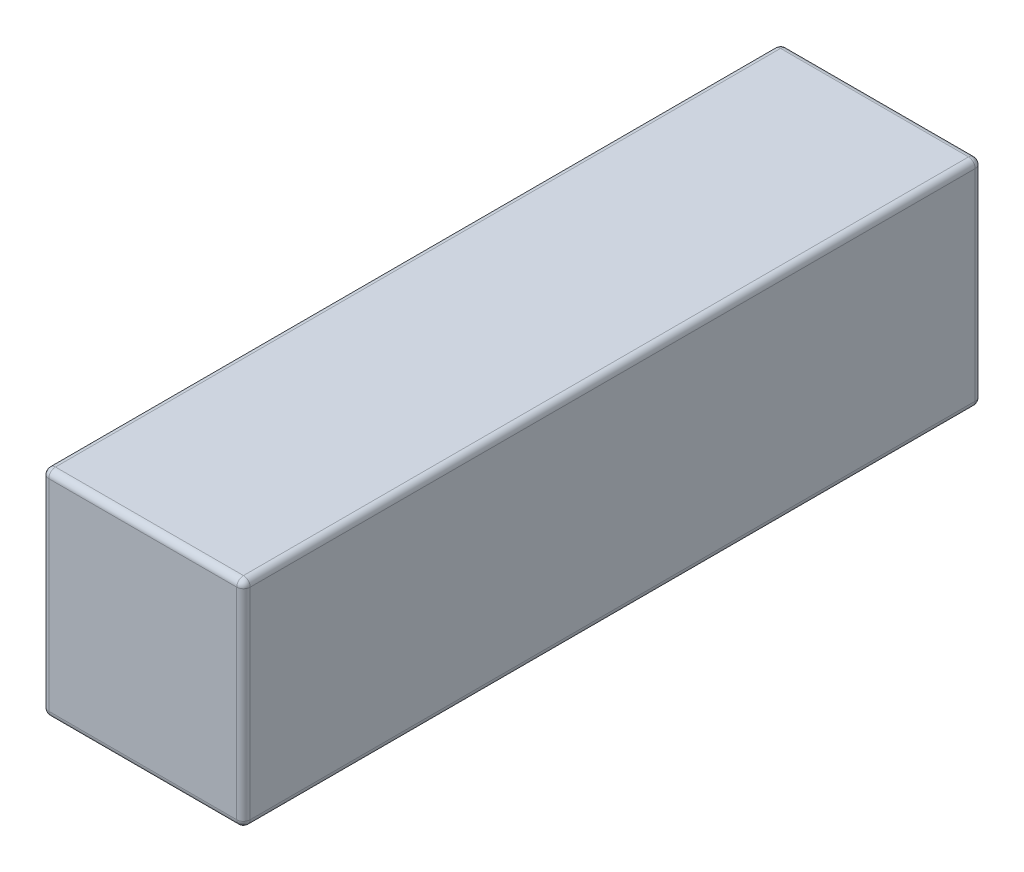
ISO-10303-21;
HEADER;
FILE_DESCRIPTION(('STEP AP214'),'2;1');
FILE_NAME('part.step','',(''),(''),'','','');
FILE_SCHEMA(('AUTOMOTIVE_DESIGN { 1 0 10303 214 1 1 1 1 }'));
ENDSEC;
DATA;
#1=APPLICATION_CONTEXT('core data for automotive mechanical design processes');
#2=APPLICATION_PROTOCOL_DEFINITION('international standard','automotive_design',2000,#1);
#3=PRODUCT_CONTEXT('',#1,'mechanical');
#4=PRODUCT('Part','Part','',(#3));
#5=PRODUCT_RELATED_PRODUCT_CATEGORY('part','',(#4));
#6=PRODUCT_DEFINITION_FORMATION('','',#4);
#7=PRODUCT_DEFINITION_CONTEXT('part definition',#1,'design');
#8=PRODUCT_DEFINITION('design','',#6,#7);
#9=PRODUCT_DEFINITION_SHAPE('','',#8);
#10=(LENGTH_UNIT() NAMED_UNIT(*) SI_UNIT(.MILLI.,.METRE.));
#11=(NAMED_UNIT(*) PLANE_ANGLE_UNIT() SI_UNIT($,.RADIAN.));
#12=(NAMED_UNIT(*) SI_UNIT($,.STERADIAN.) SOLID_ANGLE_UNIT());
#13=UNCERTAINTY_MEASURE_WITH_UNIT(LENGTH_MEASURE(1.E-05),#10,'distance_accuracy_value','');
#14=(GEOMETRIC_REPRESENTATION_CONTEXT(3) GLOBAL_UNCERTAINTY_ASSIGNED_CONTEXT((#13)) GLOBAL_UNIT_ASSIGNED_CONTEXT((#10,
#11,#12)) REPRESENTATION_CONTEXT('',''));
#15=CARTESIAN_POINT('',(0.,0.,0.));
#16=DIRECTION('',(0.,0.,1.));
#17=DIRECTION('',(1.,0.,0.));
#18=AXIS2_PLACEMENT_3D('',#15,#16,#17);
#19=CARTESIAN_POINT('',(-15.,32.,59.5535714285715));
#20=DIRECTION('',(1.,0.,0.));
#21=DIRECTION('',(0.,0.,-1.));
#22=AXIS2_PLACEMENT_3D('',#19,#20,#21);
#23=PLANE('',#22);
#24=DIRECTION('',(0.,0.,1.));
#25=VECTOR('',#24,1.);
#26=CARTESIAN_POINT('',(-15.,31.,-50.4464285714285));
#27=LINE('',#26,#25);
#28=CARTESIAN_POINT('',(-15.,31.,58.5535714285715));
#29=VERTEX_POINT('',#28);
#30=CARTESIAN_POINT('',(-15.,31.,-49.4464285714285));
#31=VERTEX_POINT('',#30);
#32=EDGE_CURVE('E177',#29,#31,#27,.F.);
#33=ORIENTED_EDGE('',*,*,#32,.T.);
#34=DIRECTION('',(0.,-1.,0.));
#35=VECTOR('',#34,1.);
#36=CARTESIAN_POINT('',(-15.,32.,-49.4464285714285));
#37=LINE('',#36,#35);
#38=CARTESIAN_POINT('',(-15.,1.,-49.4464285714285));
#39=VERTEX_POINT('',#38);
#40=EDGE_CURVE('E183',#31,#39,#37,.T.);
#41=ORIENTED_EDGE('',*,*,#40,.T.);
#42=DIRECTION('',(0.,0.,1.));
#43=VECTOR('',#42,1.);
#44=CARTESIAN_POINT('',(-15.,1.,59.5535714285715));
#45=LINE('',#44,#43);
#46=CARTESIAN_POINT('',(-15.,1.,58.5535714285715));
#47=VERTEX_POINT('',#46);
#48=EDGE_CURVE('E181',#39,#47,#45,.T.);
#49=ORIENTED_EDGE('',*,*,#48,.T.);
#50=DIRECTION('',(0.,-1.,0.));
#51=VECTOR('',#50,1.);
#52=CARTESIAN_POINT('',(-15.,32.,58.5535714285715));
#53=LINE('',#52,#51);
#54=EDGE_CURVE('E179',#47,#29,#53,.F.);
#55=ORIENTED_EDGE('',*,*,#54,.T.);
#56=EDGE_LOOP('',(#33,#41,#49,#55));
#57=FACE_BOUND('',#56,.T.);
#58=ADVANCED_FACE('F37',(#57),#23,.F.);
#59=CARTESIAN_POINT('',(15.,32.,59.5535714285715));
#60=DIRECTION('',(0.,0.,-1.));
#61=DIRECTION('',(-1.,0.,0.));
#62=AXIS2_PLACEMENT_3D('',#59,#60,#61);
#63=PLANE('',#62);
#64=DIRECTION('',(1.,0.,0.));
#65=VECTOR('',#64,1.);
#66=CARTESIAN_POINT('',(-15.,31.,59.5535714285715));
#67=LINE('',#66,#65);
#68=CARTESIAN_POINT('',(14.,31.,59.5535714285715));
#69=VERTEX_POINT('',#68);
#70=CARTESIAN_POINT('',(-14.,31.,59.5535714285715));
#71=VERTEX_POINT('',#70);
#72=EDGE_CURVE('E188',#69,#71,#67,.F.);
#73=ORIENTED_EDGE('',*,*,#72,.T.);
#74=DIRECTION('',(0.,-1.,0.));
#75=VECTOR('',#74,1.);
#76=CARTESIAN_POINT('',(-14.,32.,59.5535714285715));
#77=LINE('',#76,#75);
#78=CARTESIAN_POINT('',(-14.,1.,59.5535714285715));
#79=VERTEX_POINT('',#78);
#80=EDGE_CURVE('E192',#71,#79,#77,.T.);
#81=ORIENTED_EDGE('',*,*,#80,.T.);
#82=DIRECTION('',(1.,0.,0.));
#83=VECTOR('',#82,1.);
#84=CARTESIAN_POINT('',(15.,1.,59.5535714285715));
#85=LINE('',#84,#83);
#86=CARTESIAN_POINT('',(14.,1.,59.5535714285715));
#87=VERTEX_POINT('',#86);
#88=EDGE_CURVE('E190',#79,#87,#85,.T.);
#89=ORIENTED_EDGE('',*,*,#88,.T.);
#90=DIRECTION('',(0.,-1.,0.));
#91=VECTOR('',#90,1.);
#92=CARTESIAN_POINT('',(14.,32.,59.5535714285715));
#93=LINE('',#92,#91);
#94=EDGE_CURVE('E186',#87,#69,#93,.F.);
#95=ORIENTED_EDGE('',*,*,#94,.T.);
#96=EDGE_LOOP('',(#73,#81,#89,#95));
#97=FACE_BOUND('',#96,.T.);
#98=ADVANCED_FACE('F276',(#97),#63,.F.);
#99=CARTESIAN_POINT('',(15.,32.,59.5535714285715));
#100=DIRECTION('',(-1.,0.,0.));
#101=DIRECTION('',(0.,0.,1.));
#102=AXIS2_PLACEMENT_3D('',#99,#100,#101);
#103=PLANE('',#102);
#104=DIRECTION('',(0.,0.,-1.));
#105=VECTOR('',#104,1.);
#106=CARTESIAN_POINT('',(15.,31.,59.5535714285715));
#107=LINE('',#106,#105);
#108=CARTESIAN_POINT('',(15.,31.,-49.4464285714285));
#109=VERTEX_POINT('',#108);
#110=CARTESIAN_POINT('',(15.,31.,58.5535714285715));
#111=VERTEX_POINT('',#110);
#112=EDGE_CURVE('E46',#109,#111,#107,.F.);
#113=ORIENTED_EDGE('',*,*,#112,.T.);
#114=DIRECTION('',(0.,-1.,0.));
#115=VECTOR('',#114,1.);
#116=CARTESIAN_POINT('',(15.,32.,58.5535714285715));
#117=LINE('',#116,#115);
#118=CARTESIAN_POINT('',(15.,1.,58.5535714285715));
#119=VERTEX_POINT('',#118);
#120=EDGE_CURVE('E11',#111,#119,#117,.T.);
#121=ORIENTED_EDGE('',*,*,#120,.T.);
#122=DIRECTION('',(0.,0.,-1.));
#123=VECTOR('',#122,1.);
#124=CARTESIAN_POINT('',(15.,1.,59.5535714285715));
#125=LINE('',#124,#123);
#126=CARTESIAN_POINT('',(15.,1.,-49.4464285714285));
#127=VERTEX_POINT('',#126);
#128=EDGE_CURVE('E202',#119,#127,#125,.T.);
#129=ORIENTED_EDGE('',*,*,#128,.T.);
#130=DIRECTION('',(0.,-1.,0.));
#131=VECTOR('',#130,1.);
#132=CARTESIAN_POINT('',(15.,32.,-49.4464285714285));
#133=LINE('',#132,#131);
#134=EDGE_CURVE('E57',#127,#109,#133,.F.);
#135=ORIENTED_EDGE('',*,*,#134,.T.);
#136=EDGE_LOOP('',(#113,#121,#129,#135));
#137=FACE_BOUND('',#136,.T.);
#138=ADVANCED_FACE('F289',(#137),#103,.F.);
#139=CARTESIAN_POINT('',(15.,32.,-50.4464285714285));
#140=DIRECTION('',(0.,0.,1.));
#141=DIRECTION('',(1.,0.,0.));
#142=AXIS2_PLACEMENT_3D('',#139,#140,#141);
#143=PLANE('',#142);
#144=DIRECTION('',(0.,-1.,0.));
#145=VECTOR('',#144,1.);
#146=CARTESIAN_POINT('',(14.,32.,-50.4464285714285));
#147=LINE('',#146,#145);
#148=CARTESIAN_POINT('',(14.,31.,-50.4464285714285));
#149=VERTEX_POINT('',#148);
#150=CARTESIAN_POINT('',(14.,1.,-50.4464285714285));
#151=VERTEX_POINT('',#150);
#152=EDGE_CURVE('E129',#149,#151,#147,.T.);
#153=ORIENTED_EDGE('',*,*,#152,.T.);
#154=DIRECTION('',(-1.,0.,0.));
#155=VECTOR('',#154,1.);
#156=CARTESIAN_POINT('',(15.,1.,-50.4464285714285));
#157=LINE('',#156,#155);
#158=CARTESIAN_POINT('',(-14.,1.,-50.4464285714285));
#159=VERTEX_POINT('',#158);
#160=EDGE_CURVE('E166',#151,#159,#157,.T.);
#161=ORIENTED_EDGE('',*,*,#160,.T.);
#162=DIRECTION('',(0.,-1.,0.));
#163=VECTOR('',#162,1.);
#164=CARTESIAN_POINT('',(-14.,32.,-50.4464285714285));
#165=LINE('',#164,#163);
#166=CARTESIAN_POINT('',(-14.,31.,-50.4464285714285));
#167=VERTEX_POINT('',#166);
#168=EDGE_CURVE('E132',#159,#167,#165,.F.);
#169=ORIENTED_EDGE('',*,*,#168,.T.);
#170=DIRECTION('',(-1.,0.,0.));
#171=VECTOR('',#170,1.);
#172=CARTESIAN_POINT('',(15.,31.,-50.4464285714285));
#173=LINE('',#172,#171);
#174=EDGE_CURVE('E124',#167,#149,#173,.F.);
#175=ORIENTED_EDGE('',*,*,#174,.T.);
#176=EDGE_LOOP('',(#153,#161,#169,#175));
#177=FACE_BOUND('',#176,.T.);
#178=ADVANCED_FACE('F126',(#177),#143,.F.);
#179=CARTESIAN_POINT('',(0.,32.,0.));
#180=DIRECTION('',(0.,1.,0.));
#181=DIRECTION('',(0.,0.,1.));
#182=AXIS2_PLACEMENT_3D('',#179,#180,#181);
#183=PLANE('',#182);
#184=DIRECTION('',(-1.,0.,0.));
#185=VECTOR('',#184,1.);
#186=CARTESIAN_POINT('',(-15.,32.,-49.4464285714285));
#187=LINE('',#186,#185);
#188=CARTESIAN_POINT('',(14.,32.,-49.4464285714285));
#189=VERTEX_POINT('',#188);
#190=CARTESIAN_POINT('',(-14.,32.,-49.4464285714285));
#191=VERTEX_POINT('',#190);
#192=EDGE_CURVE('E143',#189,#191,#187,.T.);
#193=ORIENTED_EDGE('',*,*,#192,.T.);
#194=DIRECTION('',(0.,0.,1.));
#195=VECTOR('',#194,1.);
#196=CARTESIAN_POINT('',(-14.,32.,59.5535714285715));
#197=LINE('',#196,#195);
#198=CARTESIAN_POINT('',(-14.,32.,58.5535714285715));
#199=VERTEX_POINT('',#198);
#200=EDGE_CURVE('E200',#191,#199,#197,.T.);
#201=ORIENTED_EDGE('',*,*,#200,.T.);
#202=DIRECTION('',(1.,0.,0.));
#203=VECTOR('',#202,1.);
#204=CARTESIAN_POINT('',(15.,32.,58.5535714285715));
#205=LINE('',#204,#203);
#206=CARTESIAN_POINT('',(14.,32.,58.5535714285715));
#207=VERTEX_POINT('',#206);
#208=EDGE_CURVE('E197',#199,#207,#205,.T.);
#209=ORIENTED_EDGE('',*,*,#208,.T.);
#210=DIRECTION('',(0.,0.,-1.));
#211=VECTOR('',#210,1.);
#212=CARTESIAN_POINT('',(14.,32.,-50.4464285714285));
#213=LINE('',#212,#211);
#214=EDGE_CURVE('E195',#207,#189,#213,.T.);
#215=ORIENTED_EDGE('',*,*,#214,.T.);
#216=EDGE_LOOP('',(#193,#201,#209,#215));
#217=FACE_BOUND('',#216,.T.);
#218=ADVANCED_FACE('F481',(#217),#183,.T.);
#219=CARTESIAN_POINT('',(0.,0.,0.));
#220=DIRECTION('',(0.,1.,0.));
#221=DIRECTION('',(0.,0.,1.));
#222=AXIS2_PLACEMENT_3D('',#219,#220,#221);
#223=PLANE('',#222);
#224=DIRECTION('',(0.,0.,1.));
#225=VECTOR('',#224,1.);
#226=CARTESIAN_POINT('',(-14.,0.,0.));
#227=LINE('',#226,#225);
#228=CARTESIAN_POINT('',(-14.,0.,58.5535714285715));
#229=VERTEX_POINT('',#228);
#230=CARTESIAN_POINT('',(-14.,0.,-49.4464285714285));
#231=VERTEX_POINT('',#230);
#232=EDGE_CURVE('E172',#229,#231,#227,.F.);
#233=ORIENTED_EDGE('',*,*,#232,.T.);
#234=DIRECTION('',(-1.,0.,0.));
#235=VECTOR('',#234,1.);
#236=CARTESIAN_POINT('',(0.,0.,-49.4464285714285));
#237=LINE('',#236,#235);
#238=CARTESIAN_POINT('',(14.,0.,-49.4464285714285));
#239=VERTEX_POINT('',#238);
#240=EDGE_CURVE('E174',#231,#239,#237,.F.);
#241=ORIENTED_EDGE('',*,*,#240,.T.);
#242=DIRECTION('',(0.,0.,-1.));
#243=VECTOR('',#242,1.);
#244=CARTESIAN_POINT('',(14.,0.,0.));
#245=LINE('',#244,#243);
#246=CARTESIAN_POINT('',(14.,0.,58.5535714285715));
#247=VERTEX_POINT('',#246);
#248=EDGE_CURVE('E168',#239,#247,#245,.F.);
#249=ORIENTED_EDGE('',*,*,#248,.T.);
#250=DIRECTION('',(1.,0.,0.));
#251=VECTOR('',#250,1.);
#252=CARTESIAN_POINT('',(0.,0.,58.5535714285715));
#253=LINE('',#252,#251);
#254=EDGE_CURVE('E170',#247,#229,#253,.F.);
#255=ORIENTED_EDGE('',*,*,#254,.T.);
#256=EDGE_LOOP('',(#233,#241,#249,#255));
#257=FACE_BOUND('',#256,.T.);
#258=ADVANCED_FACE('F474',(#257),#223,.F.);
#259=CARTESIAN_POINT('',(0.,31.,58.5535714285715));
#260=DIRECTION('',(-1.,0.,0.));
#261=DIRECTION('',(0.,0.,1.));
#262=AXIS2_PLACEMENT_3D('',#259,#260,#261);
#263=CYLINDRICAL_SURFACE('',#262,1.);
#264=CARTESIAN_POINT('',(14.,31.,58.5535714285715));
#265=DIRECTION('',(1.,0.,0.));
#266=DIRECTION('',(0.,0.,-1.));
#267=AXIS2_PLACEMENT_3D('',#264,#265,#266);
#268=CIRCLE('',#267,1.);
#269=EDGE_CURVE('E41',#207,#69,#268,.T.);
#270=ORIENTED_EDGE('',*,*,#269,.F.);
#271=ORIENTED_EDGE('',*,*,#208,.F.);
#272=CARTESIAN_POINT('',(-14.,31.,58.5535714285715));
#273=DIRECTION('',(-1.,0.,0.));
#274=DIRECTION('',(0.,0.,1.));
#275=AXIS2_PLACEMENT_3D('',#272,#273,#274);
#276=CIRCLE('',#275,1.);
#277=EDGE_CURVE('E163',#71,#199,#276,.T.);
#278=ORIENTED_EDGE('',*,*,#277,.F.);
#279=ORIENTED_EDGE('',*,*,#72,.F.);
#280=EDGE_LOOP('',(#270,#271,#278,#279));
#281=FACE_BOUND('',#280,.T.);
#282=ADVANCED_FACE('F39',(#281),#263,.T.);
#283=CARTESIAN_POINT('',(14.,31.,58.5535714285715));
#284=DIRECTION('',(0.,0.,1.));
#285=DIRECTION('',(1.,0.,0.));
#286=AXIS2_PLACEMENT_3D('',#283,#284,#285);
#287=SPHERICAL_SURFACE('',#286,1.);
#288=CARTESIAN_POINT('',(14.,31.,58.5535714285715));
#289=DIRECTION('',(0.,0.,1.));
#290=DIRECTION('',(1.,0.,0.));
#291=AXIS2_PLACEMENT_3D('',#288,#289,#290);
#292=CIRCLE('',#291,1.);
#293=EDGE_CURVE('E247',#207,#111,#292,.F.);
#294=ORIENTED_EDGE('',*,*,#293,.F.);
#295=ORIENTED_EDGE('',*,*,#269,.T.);
#296=CARTESIAN_POINT('',(14.,31.,58.5535714285715));
#297=DIRECTION('',(0.,1.,0.));
#298=DIRECTION('',(0.,0.,1.));
#299=AXIS2_PLACEMENT_3D('',#296,#297,#298);
#300=CIRCLE('',#299,1.);
#301=EDGE_CURVE('E249',#111,#69,#300,.F.);
#302=ORIENTED_EDGE('',*,*,#301,.F.);
#303=EDGE_LOOP('',(#294,#295,#302));
#304=FACE_BOUND('',#303,.T.);
#305=ADVANCED_FACE('F282',(#304),#287,.T.);
#306=CARTESIAN_POINT('',(-14.,31.,58.5535714285715));
#307=DIRECTION('',(0.,0.,1.));
#308=DIRECTION('',(1.,0.,0.));
#309=AXIS2_PLACEMENT_3D('',#306,#307,#308);
#310=SPHERICAL_SURFACE('',#309,1.);
#311=CARTESIAN_POINT('',(-14.,31.,58.5535714285715));
#312=DIRECTION('',(0.,1.,0.));
#313=DIRECTION('',(0.,0.,1.));
#314=AXIS2_PLACEMENT_3D('',#311,#312,#313);
#315=CIRCLE('',#314,1.);
#316=EDGE_CURVE('E241',#71,#29,#315,.F.);
#317=ORIENTED_EDGE('',*,*,#316,.F.);
#318=ORIENTED_EDGE('',*,*,#277,.T.);
#319=CARTESIAN_POINT('',(-14.,31.,58.5535714285715));
#320=DIRECTION('',(0.,0.,1.));
#321=DIRECTION('',(1.,0.,0.));
#322=AXIS2_PLACEMENT_3D('',#319,#320,#321);
#323=CIRCLE('',#322,1.);
#324=EDGE_CURVE('E244',#29,#199,#323,.F.);
#325=ORIENTED_EDGE('',*,*,#324,.F.);
#326=EDGE_LOOP('',(#317,#318,#325));
#327=FACE_BOUND('',#326,.T.);
#328=ADVANCED_FACE('F256',(#327),#310,.T.);
#329=CARTESIAN_POINT('',(14.,32.,58.5535714285715));
#330=DIRECTION('',(0.,-1.,0.));
#331=DIRECTION('',(0.,0.,-1.));
#332=AXIS2_PLACEMENT_3D('',#329,#330,#331);
#333=CYLINDRICAL_SURFACE('',#332,1.);
#334=ORIENTED_EDGE('',*,*,#301,.T.);
#335=ORIENTED_EDGE('',*,*,#94,.F.);
#336=CARTESIAN_POINT('',(14.,1.,58.5535714285715));
#337=DIRECTION('',(0.,-1.,0.));
#338=DIRECTION('',(0.,0.,-1.));
#339=AXIS2_PLACEMENT_3D('',#336,#337,#338);
#340=CIRCLE('',#339,1.);
#341=EDGE_CURVE('E235',#119,#87,#340,.T.);
#342=ORIENTED_EDGE('',*,*,#341,.F.);
#343=ORIENTED_EDGE('',*,*,#120,.F.);
#344=EDGE_LOOP('',(#334,#335,#342,#343));
#345=FACE_BOUND('',#344,.T.);
#346=ADVANCED_FACE('F286',(#345),#333,.T.);
#347=CARTESIAN_POINT('',(14.,31.,0.));
#348=DIRECTION('',(0.,0.,1.));
#349=DIRECTION('',(1.,0.,0.));
#350=AXIS2_PLACEMENT_3D('',#347,#348,#349);
#351=CYLINDRICAL_SURFACE('',#350,1.);
#352=ORIENTED_EDGE('',*,*,#293,.T.);
#353=ORIENTED_EDGE('',*,*,#112,.F.);
#354=CARTESIAN_POINT('',(14.,31.,-49.4464285714285));
#355=DIRECTION('',(0.,0.,-1.));
#356=DIRECTION('',(-1.,0.,0.));
#357=AXIS2_PLACEMENT_3D('',#354,#355,#356);
#358=CIRCLE('',#357,1.);
#359=EDGE_CURVE('E147',#189,#109,#358,.T.);
#360=ORIENTED_EDGE('',*,*,#359,.F.);
#361=ORIENTED_EDGE('',*,*,#214,.F.);
#362=EDGE_LOOP('',(#352,#353,#360,#361));
#363=FACE_BOUND('',#362,.T.);
#364=ADVANCED_FACE('F438',(#363),#351,.T.);
#365=CARTESIAN_POINT('',(0.,31.,-49.4464285714285));
#366=DIRECTION('',(1.,0.,0.));
#367=DIRECTION('',(0.,0.,-1.));
#368=AXIS2_PLACEMENT_3D('',#365,#366,#367);
#369=CYLINDRICAL_SURFACE('',#368,1.);
#370=CARTESIAN_POINT('',(-14.,31.,-49.4464285714285));
#371=DIRECTION('',(-1.,0.,0.));
#372=DIRECTION('',(0.,0.,1.));
#373=AXIS2_PLACEMENT_3D('',#370,#371,#372);
#374=CIRCLE('',#373,1.);
#375=EDGE_CURVE('E148',#191,#167,#374,.T.);
#376=ORIENTED_EDGE('',*,*,#375,.F.);
#377=ORIENTED_EDGE('',*,*,#192,.F.);
#378=CARTESIAN_POINT('',(14.,31.,-49.4464285714285));
#379=DIRECTION('',(1.,0.,0.));
#380=DIRECTION('',(0.,0.,-1.));
#381=AXIS2_PLACEMENT_3D('',#378,#379,#380);
#382=CIRCLE('',#381,1.);
#383=EDGE_CURVE('E139',#149,#189,#382,.T.);
#384=ORIENTED_EDGE('',*,*,#383,.F.);
#385=ORIENTED_EDGE('',*,*,#174,.F.);
#386=EDGE_LOOP('',(#376,#377,#384,#385));
#387=FACE_BOUND('',#386,.T.);
#388=ADVANCED_FACE('F141',(#387),#369,.T.);
#389=CARTESIAN_POINT('',(-14.,31.,0.));
#390=DIRECTION('',(0.,0.,-1.));
#391=DIRECTION('',(-1.,0.,0.));
#392=AXIS2_PLACEMENT_3D('',#389,#390,#391);
#393=CYLINDRICAL_SURFACE('',#392,1.);
#394=ORIENTED_EDGE('',*,*,#324,.T.);
#395=ORIENTED_EDGE('',*,*,#200,.F.);
#396=CARTESIAN_POINT('',(-14.,31.,-49.4464285714285));
#397=DIRECTION('',(0.,0.,-1.));
#398=DIRECTION('',(-1.,0.,0.));
#399=AXIS2_PLACEMENT_3D('',#396,#397,#398);
#400=CIRCLE('',#399,1.);
#401=EDGE_CURVE('E231',#31,#191,#400,.T.);
#402=ORIENTED_EDGE('',*,*,#401,.F.);
#403=ORIENTED_EDGE('',*,*,#32,.F.);
#404=EDGE_LOOP('',(#394,#395,#402,#403));
#405=FACE_BOUND('',#404,.T.);
#406=ADVANCED_FACE('F264',(#405),#393,.T.);
#407=CARTESIAN_POINT('',(-14.,32.,58.5535714285715));
#408=DIRECTION('',(0.,-1.,0.));
#409=DIRECTION('',(0.,0.,-1.));
#410=AXIS2_PLACEMENT_3D('',#407,#408,#409);
#411=CYLINDRICAL_SURFACE('',#410,1.);
#412=ORIENTED_EDGE('',*,*,#316,.T.);
#413=ORIENTED_EDGE('',*,*,#54,.F.);
#414=CARTESIAN_POINT('',(-14.,1.,58.5535714285715));
#415=DIRECTION('',(0.,-1.,0.));
#416=DIRECTION('',(0.,0.,-1.));
#417=AXIS2_PLACEMENT_3D('',#414,#415,#416);
#418=CIRCLE('',#417,1.);
#419=EDGE_CURVE('E228',#79,#47,#418,.T.);
#420=ORIENTED_EDGE('',*,*,#419,.F.);
#421=ORIENTED_EDGE('',*,*,#80,.F.);
#422=EDGE_LOOP('',(#412,#413,#420,#421));
#423=FACE_BOUND('',#422,.T.);
#424=ADVANCED_FACE('F273',(#423),#411,.T.);
#425=CARTESIAN_POINT('',(15.,1.,58.5535714285715));
#426=DIRECTION('',(1.,0.,0.));
#427=DIRECTION('',(0.,0.,-1.));
#428=AXIS2_PLACEMENT_3D('',#425,#426,#427);
#429=CYLINDRICAL_SURFACE('',#428,1.);
#430=CARTESIAN_POINT('',(14.,1.,58.5535714285715));
#431=DIRECTION('',(1.,0.,0.));
#432=DIRECTION('',(0.,0.,-1.));
#433=AXIS2_PLACEMENT_3D('',#430,#431,#432);
#434=CIRCLE('',#433,1.);
#435=EDGE_CURVE('E238',#87,#247,#434,.T.);
#436=ORIENTED_EDGE('',*,*,#435,.F.);
#437=ORIENTED_EDGE('',*,*,#88,.F.);
#438=CARTESIAN_POINT('',(-14.,1.,58.5535714285715));
#439=DIRECTION('',(-1.,0.,0.));
#440=DIRECTION('',(0.,0.,1.));
#441=AXIS2_PLACEMENT_3D('',#438,#439,#440);
#442=CIRCLE('',#441,1.);
#443=EDGE_CURVE('E226',#229,#79,#442,.T.);
#444=ORIENTED_EDGE('',*,*,#443,.F.);
#445=ORIENTED_EDGE('',*,*,#254,.F.);
#446=EDGE_LOOP('',(#436,#437,#444,#445));
#447=FACE_BOUND('',#446,.T.);
#448=ADVANCED_FACE('F407',(#447),#429,.T.);
#449=CARTESIAN_POINT('',(14.,1.,58.5535714285715));
#450=DIRECTION('',(0.,0.,1.));
#451=DIRECTION('',(1.,0.,0.));
#452=AXIS2_PLACEMENT_3D('',#449,#450,#451);
#453=SPHERICAL_SURFACE('',#452,1.);
#454=ORIENTED_EDGE('',*,*,#341,.T.);
#455=ORIENTED_EDGE('',*,*,#435,.T.);
#456=CARTESIAN_POINT('',(14.,1.,58.5535714285715));
#457=DIRECTION('',(0.,0.,1.));
#458=DIRECTION('',(1.,0.,0.));
#459=AXIS2_PLACEMENT_3D('',#456,#457,#458);
#460=CIRCLE('',#459,1.);
#461=EDGE_CURVE('E154',#119,#247,#460,.F.);
#462=ORIENTED_EDGE('',*,*,#461,.F.);
#463=EDGE_LOOP('',(#454,#455,#462));
#464=FACE_BOUND('',#463,.T.);
#465=ADVANCED_FACE('F319',(#464),#453,.T.);
#466=CARTESIAN_POINT('',(14.,31.,-49.4464285714285));
#467=DIRECTION('',(0.,0.,1.));
#468=DIRECTION('',(1.,0.,0.));
#469=AXIS2_PLACEMENT_3D('',#466,#467,#468);
#470=SPHERICAL_SURFACE('',#469,1.);
#471=ORIENTED_EDGE('',*,*,#383,.T.);
#472=ORIENTED_EDGE('',*,*,#359,.T.);
#473=CARTESIAN_POINT('',(14.,31.,-49.4464285714285));
#474=DIRECTION('',(0.,1.,0.));
#475=DIRECTION('',(0.,0.,1.));
#476=AXIS2_PLACEMENT_3D('',#473,#474,#475);
#477=CIRCLE('',#476,1.);
#478=EDGE_CURVE('E151',#149,#109,#477,.F.);
#479=ORIENTED_EDGE('',*,*,#478,.F.);
#480=EDGE_LOOP('',(#471,#472,#479));
#481=FACE_BOUND('',#480,.T.);
#482=ADVANCED_FACE('F152',(#481),#470,.T.);
#483=CARTESIAN_POINT('',(-14.,31.,-49.4464285714285));
#484=DIRECTION('',(0.,0.,1.));
#485=DIRECTION('',(1.,0.,0.));
#486=AXIS2_PLACEMENT_3D('',#483,#484,#485);
#487=SPHERICAL_SURFACE('',#486,1.);
#488=ORIENTED_EDGE('',*,*,#401,.T.);
#489=ORIENTED_EDGE('',*,*,#375,.T.);
#490=CARTESIAN_POINT('',(-14.,31.,-49.4464285714285));
#491=DIRECTION('',(0.,1.,0.));
#492=DIRECTION('',(0.,0.,1.));
#493=AXIS2_PLACEMENT_3D('',#490,#491,#492);
#494=CIRCLE('',#493,1.);
#495=EDGE_CURVE('E155',#31,#167,#494,.F.);
#496=ORIENTED_EDGE('',*,*,#495,.F.);
#497=EDGE_LOOP('',(#488,#489,#496));
#498=FACE_BOUND('',#497,.T.);
#499=ADVANCED_FACE('F309',(#498),#487,.T.);
#500=CARTESIAN_POINT('',(-14.,1.,58.5535714285715));
#501=DIRECTION('',(0.,0.,1.));
#502=DIRECTION('',(1.,0.,0.));
#503=AXIS2_PLACEMENT_3D('',#500,#501,#502);
#504=SPHERICAL_SURFACE('',#503,1.);
#505=ORIENTED_EDGE('',*,*,#443,.T.);
#506=ORIENTED_EDGE('',*,*,#419,.T.);
#507=CARTESIAN_POINT('',(-14.,1.,58.5535714285715));
#508=DIRECTION('',(0.,0.,1.));
#509=DIRECTION('',(1.,0.,0.));
#510=AXIS2_PLACEMENT_3D('',#507,#508,#509);
#511=CIRCLE('',#510,1.);
#512=EDGE_CURVE('E219',#229,#47,#511,.F.);
#513=ORIENTED_EDGE('',*,*,#512,.F.);
#514=EDGE_LOOP('',(#505,#506,#513));
#515=FACE_BOUND('',#514,.T.);
#516=ADVANCED_FACE('F311',(#515),#504,.T.);
#517=CARTESIAN_POINT('',(14.,1.,59.5535714285715));
#518=DIRECTION('',(0.,0.,-1.));
#519=DIRECTION('',(-1.,0.,0.));
#520=AXIS2_PLACEMENT_3D('',#517,#518,#519);
#521=CYLINDRICAL_SURFACE('',#520,1.);
#522=ORIENTED_EDGE('',*,*,#461,.T.);
#523=ORIENTED_EDGE('',*,*,#248,.F.);
#524=CARTESIAN_POINT('',(14.,1.,-49.4464285714285));
#525=DIRECTION('',(0.,0.,-1.));
#526=DIRECTION('',(-1.,0.,0.));
#527=AXIS2_PLACEMENT_3D('',#524,#525,#526);
#528=CIRCLE('',#527,1.);
#529=EDGE_CURVE('E216',#127,#239,#528,.T.);
#530=ORIENTED_EDGE('',*,*,#529,.F.);
#531=ORIENTED_EDGE('',*,*,#128,.F.);
#532=EDGE_LOOP('',(#522,#523,#530,#531));
#533=FACE_BOUND('',#532,.T.);
#534=ADVANCED_FACE('F294',(#533),#521,.T.);
#535=CARTESIAN_POINT('',(14.,32.,-49.4464285714285));
#536=DIRECTION('',(0.,-1.,0.));
#537=DIRECTION('',(0.,0.,-1.));
#538=AXIS2_PLACEMENT_3D('',#535,#536,#537);
#539=CYLINDRICAL_SURFACE('',#538,1.);
#540=ORIENTED_EDGE('',*,*,#478,.T.);
#541=ORIENTED_EDGE('',*,*,#134,.F.);
#542=CARTESIAN_POINT('',(14.,1.,-49.4464285714285));
#543=DIRECTION('',(0.,-1.,0.));
#544=DIRECTION('',(0.,0.,-1.));
#545=AXIS2_PLACEMENT_3D('',#542,#543,#544);
#546=CIRCLE('',#545,1.);
#547=EDGE_CURVE('E159',#151,#127,#546,.T.);
#548=ORIENTED_EDGE('',*,*,#547,.F.);
#549=ORIENTED_EDGE('',*,*,#152,.F.);
#550=EDGE_LOOP('',(#540,#541,#548,#549));
#551=FACE_BOUND('',#550,.T.);
#552=ADVANCED_FACE('F157',(#551),#539,.T.);
#553=CARTESIAN_POINT('',(-14.,32.,-49.4464285714285));
#554=DIRECTION('',(0.,-1.,0.));
#555=DIRECTION('',(0.,0.,-1.));
#556=AXIS2_PLACEMENT_3D('',#553,#554,#555);
#557=CYLINDRICAL_SURFACE('',#556,1.);
#558=ORIENTED_EDGE('',*,*,#495,.T.);
#559=ORIENTED_EDGE('',*,*,#168,.F.);
#560=CARTESIAN_POINT('',(-14.,1.,-49.4464285714285));
#561=DIRECTION('',(0.,-1.,0.));
#562=DIRECTION('',(0.,0.,-1.));
#563=AXIS2_PLACEMENT_3D('',#560,#561,#562);
#564=CIRCLE('',#563,1.);
#565=EDGE_CURVE('E212',#39,#159,#564,.T.);
#566=ORIENTED_EDGE('',*,*,#565,.F.);
#567=ORIENTED_EDGE('',*,*,#40,.F.);
#568=EDGE_LOOP('',(#558,#559,#566,#567));
#569=FACE_BOUND('',#568,.T.);
#570=ADVANCED_FACE('F307',(#569),#557,.T.);
#571=CARTESIAN_POINT('',(-14.,1.,59.5535714285715));
#572=DIRECTION('',(0.,0.,1.));
#573=DIRECTION('',(1.,0.,0.));
#574=AXIS2_PLACEMENT_3D('',#571,#572,#573);
#575=CYLINDRICAL_SURFACE('',#574,1.);
#576=ORIENTED_EDGE('',*,*,#512,.T.);
#577=ORIENTED_EDGE('',*,*,#48,.F.);
#578=CARTESIAN_POINT('',(-14.,1.,-49.4464285714285));
#579=DIRECTION('',(0.,0.,-1.));
#580=DIRECTION('',(-1.,0.,0.));
#581=AXIS2_PLACEMENT_3D('',#578,#579,#580);
#582=CIRCLE('',#581,1.);
#583=EDGE_CURVE('E210',#231,#39,#582,.T.);
#584=ORIENTED_EDGE('',*,*,#583,.F.);
#585=ORIENTED_EDGE('',*,*,#232,.F.);
#586=EDGE_LOOP('',(#576,#577,#584,#585));
#587=FACE_BOUND('',#586,.T.);
#588=ADVANCED_FACE('F335',(#587),#575,.T.);
#589=CARTESIAN_POINT('',(14.,1.,-49.4464285714285));
#590=DIRECTION('',(0.,0.,1.));
#591=DIRECTION('',(1.,0.,0.));
#592=AXIS2_PLACEMENT_3D('',#589,#590,#591);
#593=SPHERICAL_SURFACE('',#592,1.);
#594=ORIENTED_EDGE('',*,*,#547,.T.);
#595=ORIENTED_EDGE('',*,*,#529,.T.);
#596=CARTESIAN_POINT('',(14.,1.,-49.4464285714285));
#597=DIRECTION('',(1.,0.,0.));
#598=DIRECTION('',(0.,0.,-1.));
#599=AXIS2_PLACEMENT_3D('',#596,#597,#598);
#600=CIRCLE('',#599,1.);
#601=EDGE_CURVE('E208',#151,#239,#600,.F.);
#602=ORIENTED_EDGE('',*,*,#601,.F.);
#603=EDGE_LOOP('',(#594,#595,#602));
#604=FACE_BOUND('',#603,.T.);
#605=ADVANCED_FACE('F296',(#604),#593,.T.);
#606=CARTESIAN_POINT('',(-14.,1.,-49.4464285714285));
#607=DIRECTION('',(0.,0.,1.));
#608=DIRECTION('',(1.,0.,0.));
#609=AXIS2_PLACEMENT_3D('',#606,#607,#608);
#610=SPHERICAL_SURFACE('',#609,1.);
#611=ORIENTED_EDGE('',*,*,#583,.T.);
#612=ORIENTED_EDGE('',*,*,#565,.T.);
#613=CARTESIAN_POINT('',(-14.,1.,-49.4464285714285));
#614=DIRECTION('',(-1.,0.,0.));
#615=DIRECTION('',(0.,0.,1.));
#616=AXIS2_PLACEMENT_3D('',#613,#614,#615);
#617=CIRCLE('',#616,1.);
#618=EDGE_CURVE('E206',#231,#159,#617,.F.);
#619=ORIENTED_EDGE('',*,*,#618,.F.);
#620=EDGE_LOOP('',(#611,#612,#619));
#621=FACE_BOUND('',#620,.T.);
#622=ADVANCED_FACE('F304',(#621),#610,.T.);
#623=CARTESIAN_POINT('',(15.,1.,-49.4464285714285));
#624=DIRECTION('',(-1.,0.,0.));
#625=DIRECTION('',(0.,0.,1.));
#626=AXIS2_PLACEMENT_3D('',#623,#624,#625);
#627=CYLINDRICAL_SURFACE('',#626,1.);
#628=ORIENTED_EDGE('',*,*,#601,.T.);
#629=ORIENTED_EDGE('',*,*,#240,.F.);
#630=ORIENTED_EDGE('',*,*,#618,.T.);
#631=ORIENTED_EDGE('',*,*,#160,.F.);
#632=EDGE_LOOP('',(#628,#629,#630,#631));
#633=FACE_BOUND('',#632,.T.);
#634=ADVANCED_FACE('F300',(#633),#627,.T.);
#635=CLOSED_SHELL('',(#58,#98,#138,#178,#218,#258,#282,#305,#328,#346,#364,#388,#406,#424,#448,
#465,#482,#499,#516,#534,#552,#570,#588,#605,#622,#634));
#636=MANIFOLD_SOLID_BREP('B2',#635);
#637=ADVANCED_BREP_SHAPE_REPRESENTATION('',(#18,#636),#14);
#638=SHAPE_DEFINITION_REPRESENTATION(#9,#637);
ENDSEC;
END-ISO-10303-21;
